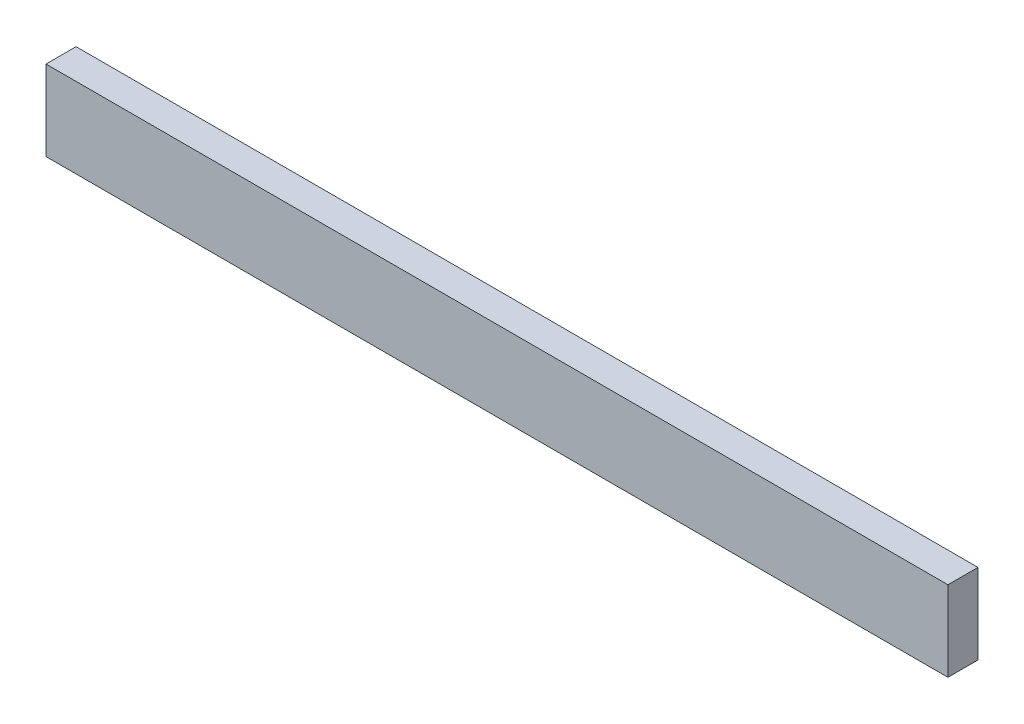
ISO-10303-21;
HEADER;
FILE_DESCRIPTION(('STEP AP214'),'2;1');
FILE_NAME('part.step','',(''),(''),'','','');
FILE_SCHEMA(('AUTOMOTIVE_DESIGN { 1 0 10303 214 1 1 1 1 }'));
ENDSEC;
DATA;
#1=APPLICATION_CONTEXT('core data for automotive mechanical design processes');
#2=APPLICATION_PROTOCOL_DEFINITION('international standard','automotive_design',2000,#1);
#3=PRODUCT_CONTEXT('',#1,'mechanical');
#4=PRODUCT('Part','Part','',(#3));
#5=PRODUCT_RELATED_PRODUCT_CATEGORY('part','',(#4));
#6=PRODUCT_DEFINITION_FORMATION('','',#4);
#7=PRODUCT_DEFINITION_CONTEXT('part definition',#1,'design');
#8=PRODUCT_DEFINITION('design','',#6,#7);
#9=PRODUCT_DEFINITION_SHAPE('','',#8);
#10=(LENGTH_UNIT() NAMED_UNIT(*) SI_UNIT(.MILLI.,.METRE.));
#11=(NAMED_UNIT(*) PLANE_ANGLE_UNIT() SI_UNIT($,.RADIAN.));
#12=(NAMED_UNIT(*) SI_UNIT($,.STERADIAN.) SOLID_ANGLE_UNIT());
#13=UNCERTAINTY_MEASURE_WITH_UNIT(LENGTH_MEASURE(1.E-05),#10,'distance_accuracy_value','');
#14=(GEOMETRIC_REPRESENTATION_CONTEXT(3) GLOBAL_UNCERTAINTY_ASSIGNED_CONTEXT((#13)) GLOBAL_UNIT_ASSIGNED_CONTEXT((#10,
#11,#12)) REPRESENTATION_CONTEXT('',''));
#15=CARTESIAN_POINT('',(0.,0.,0.));
#16=DIRECTION('',(0.,0.,1.));
#17=DIRECTION('',(1.,0.,0.));
#18=AXIS2_PLACEMENT_3D('',#15,#16,#17);
#19=CARTESIAN_POINT('',(45.,-4.,3.));
#20=DIRECTION('',(-1.,0.,0.));
#21=DIRECTION('',(0.,0.,1.));
#22=AXIS2_PLACEMENT_3D('',#19,#20,#21);
#23=PLANE('',#22);
#24=DIRECTION('',(0.,1.,0.));
#25=VECTOR('',#24,1.);
#26=CARTESIAN_POINT('',(45.,-4.,0.));
#27=LINE('',#26,#25);
#28=CARTESIAN_POINT('',(45.,-4.,0.));
#29=VERTEX_POINT('',#28);
#30=CARTESIAN_POINT('',(45.,4.,0.));
#31=VERTEX_POINT('',#30);
#32=EDGE_CURVE('E96',#29,#31,#27,.T.);
#33=ORIENTED_EDGE('',*,*,#32,.T.);
#34=DIRECTION('',(0.,0.,-1.));
#35=VECTOR('',#34,1.);
#36=CARTESIAN_POINT('',(45.,4.,3.));
#37=LINE('',#36,#35);
#38=CARTESIAN_POINT('',(45.,4.,3.));
#39=VERTEX_POINT('',#38);
#40=EDGE_CURVE('E11',#39,#31,#37,.T.);
#41=ORIENTED_EDGE('',*,*,#40,.F.);
#42=DIRECTION('',(0.,1.,0.));
#43=VECTOR('',#42,1.);
#44=CARTESIAN_POINT('',(45.,-4.,3.));
#45=LINE('',#44,#43);
#46=CARTESIAN_POINT('',(45.,-4.,3.));
#47=VERTEX_POINT('',#46);
#48=EDGE_CURVE('E84',#47,#39,#45,.T.);
#49=ORIENTED_EDGE('',*,*,#48,.F.);
#50=DIRECTION('',(0.,0.,-1.));
#51=VECTOR('',#50,1.);
#52=CARTESIAN_POINT('',(45.,-4.,3.));
#53=LINE('',#52,#51);
#54=EDGE_CURVE('E92',#47,#29,#53,.T.);
#55=ORIENTED_EDGE('',*,*,#54,.T.);
#56=EDGE_LOOP('',(#33,#41,#49,#55));
#57=FACE_BOUND('',#56,.T.);
#58=ADVANCED_FACE('F33',(#57),#23,.F.);
#59=CARTESIAN_POINT('',(-45.,4.,3.));
#60=DIRECTION('',(0.,-1.,0.));
#61=DIRECTION('',(0.,0.,-1.));
#62=AXIS2_PLACEMENT_3D('',#59,#60,#61);
#63=PLANE('',#62);
#64=DIRECTION('',(-1.,0.,0.));
#65=VECTOR('',#64,1.);
#66=CARTESIAN_POINT('',(-45.,4.,0.));
#67=LINE('',#66,#65);
#68=CARTESIAN_POINT('',(-45.,4.,0.));
#69=VERTEX_POINT('',#68);
#70=EDGE_CURVE('E88',#31,#69,#67,.T.);
#71=ORIENTED_EDGE('',*,*,#70,.T.);
#72=DIRECTION('',(0.,0.,-1.));
#73=VECTOR('',#72,1.);
#74=CARTESIAN_POINT('',(-45.,4.,3.));
#75=LINE('',#74,#73);
#76=CARTESIAN_POINT('',(-45.,4.,3.));
#77=VERTEX_POINT('',#76);
#78=EDGE_CURVE('E41',#77,#69,#75,.T.);
#79=ORIENTED_EDGE('',*,*,#78,.F.);
#80=DIRECTION('',(-1.,0.,0.));
#81=VECTOR('',#80,1.);
#82=CARTESIAN_POINT('',(-45.,4.,3.));
#83=LINE('',#82,#81);
#84=EDGE_CURVE('E79',#39,#77,#83,.T.);
#85=ORIENTED_EDGE('',*,*,#84,.F.);
#86=ORIENTED_EDGE('',*,*,#40,.T.);
#87=EDGE_LOOP('',(#71,#79,#85,#86));
#88=FACE_BOUND('',#87,.T.);
#89=ADVANCED_FACE('F87',(#88),#63,.F.);
#90=CARTESIAN_POINT('',(-45.,-4.,3.));
#91=DIRECTION('',(1.,0.,0.));
#92=DIRECTION('',(0.,0.,-1.));
#93=AXIS2_PLACEMENT_3D('',#90,#91,#92);
#94=PLANE('',#93);
#95=DIRECTION('',(0.,-1.,0.));
#96=VECTOR('',#95,1.);
#97=CARTESIAN_POINT('',(-45.,-4.,0.));
#98=LINE('',#97,#96);
#99=CARTESIAN_POINT('',(-45.,-4.,0.));
#100=VERTEX_POINT('',#99);
#101=EDGE_CURVE('E66',#69,#100,#98,.T.);
#102=ORIENTED_EDGE('',*,*,#101,.T.);
#103=DIRECTION('',(0.,0.,-1.));
#104=VECTOR('',#103,1.);
#105=CARTESIAN_POINT('',(-45.,-4.,3.));
#106=LINE('',#105,#104);
#107=CARTESIAN_POINT('',(-45.,-4.,3.));
#108=VERTEX_POINT('',#107);
#109=EDGE_CURVE('E89',#108,#100,#106,.T.);
#110=ORIENTED_EDGE('',*,*,#109,.F.);
#111=DIRECTION('',(0.,-1.,0.));
#112=VECTOR('',#111,1.);
#113=CARTESIAN_POINT('',(-45.,-4.,3.));
#114=LINE('',#113,#112);
#115=EDGE_CURVE('E82',#77,#108,#114,.T.);
#116=ORIENTED_EDGE('',*,*,#115,.F.);
#117=ORIENTED_EDGE('',*,*,#78,.T.);
#118=EDGE_LOOP('',(#102,#110,#116,#117));
#119=FACE_BOUND('',#118,.T.);
#120=ADVANCED_FACE('F90',(#119),#94,.F.);
#121=CARTESIAN_POINT('',(-45.,-4.,3.));
#122=DIRECTION('',(0.,1.,0.));
#123=DIRECTION('',(0.,0.,1.));
#124=AXIS2_PLACEMENT_3D('',#121,#122,#123);
#125=PLANE('',#124);
#126=DIRECTION('',(1.,0.,0.));
#127=VECTOR('',#126,1.);
#128=CARTESIAN_POINT('',(-45.,-4.,0.));
#129=LINE('',#128,#127);
#130=EDGE_CURVE('E72',#100,#29,#129,.T.);
#131=ORIENTED_EDGE('',*,*,#130,.T.);
#132=ORIENTED_EDGE('',*,*,#54,.F.);
#133=DIRECTION('',(1.,0.,0.));
#134=VECTOR('',#133,1.);
#135=CARTESIAN_POINT('',(-45.,-4.,3.));
#136=LINE('',#135,#134);
#137=EDGE_CURVE('E49',#108,#47,#136,.T.);
#138=ORIENTED_EDGE('',*,*,#137,.F.);
#139=ORIENTED_EDGE('',*,*,#109,.T.);
#140=EDGE_LOOP('',(#131,#132,#138,#139));
#141=FACE_BOUND('',#140,.T.);
#142=ADVANCED_FACE('F103',(#141),#125,.F.);
#143=CARTESIAN_POINT('',(45.,4.,3.));
#144=DIRECTION('',(0.,0.,-1.));
#145=DIRECTION('',(-1.,0.,0.));
#146=AXIS2_PLACEMENT_3D('',#143,#144,#145);
#147=PLANE('',#146);
#148=ORIENTED_EDGE('',*,*,#48,.T.);
#149=ORIENTED_EDGE('',*,*,#84,.T.);
#150=ORIENTED_EDGE('',*,*,#115,.T.);
#151=ORIENTED_EDGE('',*,*,#137,.T.);
#152=EDGE_LOOP('',(#148,#149,#150,#151));
#153=FACE_BOUND('',#152,.T.);
#154=ADVANCED_FACE('F80',(#153),#147,.F.);
#155=CARTESIAN_POINT('',(45.,4.,0.));
#156=DIRECTION('',(0.,0.,-1.));
#157=DIRECTION('',(-1.,0.,0.));
#158=AXIS2_PLACEMENT_3D('',#155,#156,#157);
#159=PLANE('',#158);
#160=ORIENTED_EDGE('',*,*,#32,.F.);
#161=ORIENTED_EDGE('',*,*,#130,.F.);
#162=ORIENTED_EDGE('',*,*,#101,.F.);
#163=ORIENTED_EDGE('',*,*,#70,.F.);
#164=EDGE_LOOP('',(#160,#161,#162,#163));
#165=FACE_BOUND('',#164,.T.);
#166=ADVANCED_FACE('F106',(#165),#159,.T.);
#167=CLOSED_SHELL('',(#58,#89,#120,#142,#154,#166));
#168=MANIFOLD_SOLID_BREP('B2',#167);
#169=ADVANCED_BREP_SHAPE_REPRESENTATION('',(#18,#168),#14);
#170=SHAPE_DEFINITION_REPRESENTATION(#9,#169);
ENDSEC;
END-ISO-10303-21;
